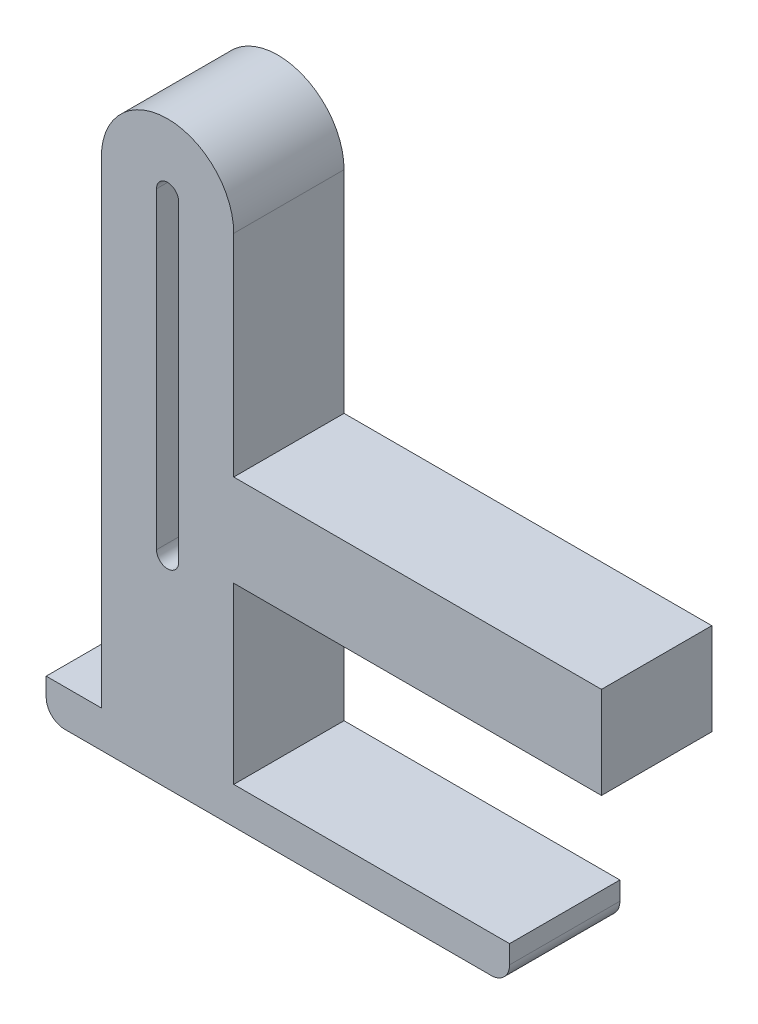
ISO-10303-21;
HEADER;
FILE_DESCRIPTION(('STEP AP214'),'2;1');
FILE_NAME('part.step','',(''),(''),'','','');
FILE_SCHEMA(('AUTOMOTIVE_DESIGN { 1 0 10303 214 1 1 1 1 }'));
ENDSEC;
DATA;
#1=APPLICATION_CONTEXT('core data for automotive mechanical design processes');
#2=APPLICATION_PROTOCOL_DEFINITION('international standard','automotive_design',2000,#1);
#3=PRODUCT_CONTEXT('',#1,'mechanical');
#4=PRODUCT('Part','Part','',(#3));
#5=PRODUCT_RELATED_PRODUCT_CATEGORY('part','',(#4));
#6=PRODUCT_DEFINITION_FORMATION('','',#4);
#7=PRODUCT_DEFINITION_CONTEXT('part definition',#1,'design');
#8=PRODUCT_DEFINITION('design','',#6,#7);
#9=PRODUCT_DEFINITION_SHAPE('','',#8);
#10=(LENGTH_UNIT() NAMED_UNIT(*) SI_UNIT(.MILLI.,.METRE.));
#11=(NAMED_UNIT(*) PLANE_ANGLE_UNIT() SI_UNIT($,.RADIAN.));
#12=(NAMED_UNIT(*) SI_UNIT($,.STERADIAN.) SOLID_ANGLE_UNIT());
#13=UNCERTAINTY_MEASURE_WITH_UNIT(LENGTH_MEASURE(1.E-05),#10,'distance_accuracy_value','');
#14=(GEOMETRIC_REPRESENTATION_CONTEXT(3) GLOBAL_UNCERTAINTY_ASSIGNED_CONTEXT((#13)) GLOBAL_UNIT_ASSIGNED_CONTEXT((#10,
#11,#12)) REPRESENTATION_CONTEXT('',''));
#15=CARTESIAN_POINT('',(0.,0.,0.));
#16=DIRECTION('',(0.,0.,1.));
#17=DIRECTION('',(1.,0.,0.));
#18=AXIS2_PLACEMENT_3D('',#15,#16,#17);
#19=CARTESIAN_POINT('',(3.6,0.,6.));
#20=DIRECTION('',(-1.,0.,0.));
#21=DIRECTION('',(0.,0.,1.));
#22=AXIS2_PLACEMENT_3D('',#19,#20,#21);
#23=PLANE('',#22);
#24=DIRECTION('',(0.,0.,1.));
#25=VECTOR('',#24,1.);
#26=CARTESIAN_POINT('',(3.6,5.522835855,6.));
#27=LINE('',#26,#25);
#28=CARTESIAN_POINT('',(3.6,5.522835855,0.));
#29=VERTEX_POINT('',#28);
#30=CARTESIAN_POINT('',(3.6,5.522835855,6.));
#31=VERTEX_POINT('',#30);
#32=EDGE_CURVE('E205',#29,#31,#27,.T.);
#33=ORIENTED_EDGE('',*,*,#32,.F.);
#34=DIRECTION('',(0.,1.,0.));
#35=VECTOR('',#34,1.);
#36=CARTESIAN_POINT('',(3.6,0.,0.));
#37=LINE('',#36,#35);
#38=CARTESIAN_POINT('',(3.6,17.,0.));
#39=VERTEX_POINT('',#38);
#40=EDGE_CURVE('E277',#29,#39,#37,.T.);
#41=ORIENTED_EDGE('',*,*,#40,.T.);
#42=DIRECTION('',(0.,0.,-1.));
#43=VECTOR('',#42,1.);
#44=CARTESIAN_POINT('',(3.6,17.,6.));
#45=LINE('',#44,#43);
#46=CARTESIAN_POINT('',(3.6,17.,6.));
#47=VERTEX_POINT('',#46);
#48=EDGE_CURVE('E285',#47,#39,#45,.T.);
#49=ORIENTED_EDGE('',*,*,#48,.F.);
#50=DIRECTION('',(0.,1.,0.));
#51=VECTOR('',#50,1.);
#52=CARTESIAN_POINT('',(3.6,0.,6.));
#53=LINE('',#52,#51);
#54=EDGE_CURVE('E269',#31,#47,#53,.T.);
#55=ORIENTED_EDGE('',*,*,#54,.F.);
#56=EDGE_LOOP('',(#33,#41,#49,#55));
#57=FACE_BOUND('',#56,.T.);
#58=ADVANCED_FACE('F36',(#57),#23,.F.);
#59=CARTESIAN_POINT('',(3.6,-8.95432829,6.));
#60=VERTEX_POINT('',#59);
#61=CARTESIAN_POINT('',(3.6,0.522835855000001,6.));
#62=VERTEX_POINT('',#61);
#63=EDGE_CURVE('E270',#60,#62,#53,.T.);
#64=ORIENTED_EDGE('',*,*,#63,.F.);
#65=DIRECTION('',(0.,0.,-1.));
#66=VECTOR('',#65,1.);
#67=CARTESIAN_POINT('',(3.6,-8.95432829,6.));
#68=LINE('',#67,#66);
#69=CARTESIAN_POINT('',(3.6,-8.95432829,0.));
#70=VERTEX_POINT('',#69);
#71=EDGE_CURVE('E201',#60,#70,#68,.T.);
#72=ORIENTED_EDGE('',*,*,#71,.T.);
#73=CARTESIAN_POINT('',(3.6,0.522835855000001,0.));
#74=VERTEX_POINT('',#73);
#75=EDGE_CURVE('E182',#70,#74,#37,.T.);
#76=ORIENTED_EDGE('',*,*,#75,.T.);
#77=DIRECTION('',(0.,0.,-1.));
#78=VECTOR('',#77,1.);
#79=CARTESIAN_POINT('',(3.6,0.522835855000002,6.));
#80=LINE('',#79,#78);
#81=EDGE_CURVE('E210',#62,#74,#80,.T.);
#82=ORIENTED_EDGE('',*,*,#81,.F.);
#83=EDGE_LOOP('',(#64,#72,#76,#82));
#84=FACE_BOUND('',#83,.T.);
#85=ADVANCED_FACE('F343',(#84),#23,.F.);
#86=CARTESIAN_POINT('',(0.,17.,6.));
#87=DIRECTION('',(0.,0.,1.));
#88=DIRECTION('',(1.,0.,0.));
#89=AXIS2_PLACEMENT_3D('',#86,#87,#88);
#90=PLANE('',#89);
#91=DIRECTION('',(1.,0.,0.));
#92=VECTOR('',#91,1.);
#93=CARTESIAN_POINT('',(3.6,-10.95432829,6.));
#94=LINE('',#93,#92);
#95=CARTESIAN_POINT('',(-5.6,-10.95432829,6.));
#96=VERTEX_POINT('',#95);
#97=CARTESIAN_POINT('',(17.6,-10.95432829,6.));
#98=VERTEX_POINT('',#97);
#99=EDGE_CURVE('E266',#96,#98,#94,.T.);
#100=ORIENTED_EDGE('',*,*,#99,.T.);
#101=CARTESIAN_POINT('',(17.6,-9.95432829,6.));
#102=DIRECTION('',(0.,0.,1.));
#103=DIRECTION('',(1.,0.,0.));
#104=AXIS2_PLACEMENT_3D('',#101,#102,#103);
#105=CIRCLE('',#104,1.);
#106=CARTESIAN_POINT('',(18.6,-9.95432829,6.));
#107=VERTEX_POINT('',#106);
#108=EDGE_CURVE('E44',#98,#107,#105,.T.);
#109=ORIENTED_EDGE('',*,*,#108,.T.);
#110=DIRECTION('',(0.,-1.,0.));
#111=VECTOR('',#110,1.);
#112=CARTESIAN_POINT('',(18.6,-8.95432829,6.));
#113=LINE('',#112,#111);
#114=CARTESIAN_POINT('',(18.6,-8.95432829,6.));
#115=VERTEX_POINT('',#114);
#116=EDGE_CURVE('E174',#115,#107,#113,.T.);
#117=ORIENTED_EDGE('',*,*,#116,.F.);
#118=DIRECTION('',(1.,0.,0.));
#119=VECTOR('',#118,1.);
#120=CARTESIAN_POINT('',(-6.6,-8.95432829,6.));
#121=LINE('',#120,#119);
#122=EDGE_CURVE('E190',#60,#115,#121,.T.);
#123=ORIENTED_EDGE('',*,*,#122,.F.);
#124=ORIENTED_EDGE('',*,*,#63,.T.);
#125=DIRECTION('',(-1.,0.,0.));
#126=VECTOR('',#125,1.);
#127=CARTESIAN_POINT('',(23.6,0.522835855000002,6.));
#128=LINE('',#127,#126);
#129=CARTESIAN_POINT('',(23.6,0.522835855000002,6.));
#130=VERTEX_POINT('',#129);
#131=EDGE_CURVE('E222',#130,#62,#128,.T.);
#132=ORIENTED_EDGE('',*,*,#131,.F.);
#133=DIRECTION('',(0.,-1.,0.));
#134=VECTOR('',#133,1.);
#135=CARTESIAN_POINT('',(23.6,0.522835855000002,6.));
#136=LINE('',#135,#134);
#137=CARTESIAN_POINT('',(23.6,5.522835855,6.));
#138=VERTEX_POINT('',#137);
#139=EDGE_CURVE('E212',#138,#130,#136,.T.);
#140=ORIENTED_EDGE('',*,*,#139,.F.);
#141=DIRECTION('',(-1.,0.,0.));
#142=VECTOR('',#141,1.);
#143=CARTESIAN_POINT('',(23.6,5.522835855,6.));
#144=LINE('',#143,#142);
#145=EDGE_CURVE('E225',#138,#31,#144,.T.);
#146=ORIENTED_EDGE('',*,*,#145,.T.);
#147=ORIENTED_EDGE('',*,*,#54,.T.);
#148=CARTESIAN_POINT('',(0.,17.,6.));
#149=DIRECTION('',(0.,0.,1.));
#150=DIRECTION('',(1.,0.,0.));
#151=AXIS2_PLACEMENT_3D('',#148,#149,#150);
#152=CIRCLE('',#151,3.6);
#153=CARTESIAN_POINT('',(-3.6,17.,6.));
#154=VERTEX_POINT('',#153);
#155=EDGE_CURVE('E272',#47,#154,#152,.T.);
#156=ORIENTED_EDGE('',*,*,#155,.T.);
#157=DIRECTION('',(0.,-1.,0.));
#158=VECTOR('',#157,1.);
#159=CARTESIAN_POINT('',(-3.6,-10.95432829,6.));
#160=LINE('',#159,#158);
#161=CARTESIAN_POINT('',(-3.6,-8.95432829,6.));
#162=VERTEX_POINT('',#161);
#163=EDGE_CURVE('E263',#154,#162,#160,.T.);
#164=ORIENTED_EDGE('',*,*,#163,.T.);
#165=CARTESIAN_POINT('',(-6.6,-8.95432829,6.));
#166=VERTEX_POINT('',#165);
#167=EDGE_CURVE('E200',#166,#162,#121,.T.);
#168=ORIENTED_EDGE('',*,*,#167,.F.);
#169=DIRECTION('',(0.,-1.,0.));
#170=VECTOR('',#169,1.);
#171=CARTESIAN_POINT('',(-6.6,-8.95432829,6.));
#172=LINE('',#171,#170);
#173=CARTESIAN_POINT('',(-6.6,-9.95432829,6.));
#174=VERTEX_POINT('',#173);
#175=EDGE_CURVE('E191',#166,#174,#172,.T.);
#176=ORIENTED_EDGE('',*,*,#175,.T.);
#177=CARTESIAN_POINT('',(-5.6,-9.95432829,6.));
#178=DIRECTION('',(0.,0.,1.));
#179=DIRECTION('',(1.,0.,0.));
#180=AXIS2_PLACEMENT_3D('',#177,#178,#179);
#181=CIRCLE('',#180,1.);
#182=EDGE_CURVE('E300',#174,#96,#181,.T.);
#183=ORIENTED_EDGE('',*,*,#182,.T.);
#184=EDGE_LOOP('',(#100,#109,#117,#123,#124,#132,#140,#146,#147,#156,#164,#168,#176,#183));
#185=FACE_BOUND('',#184,.T.);
#186=DIRECTION('',(0.,1.,0.));
#187=VECTOR('',#186,1.);
#188=CARTESIAN_POINT('',(0.600000000000001,0.,6.));
#189=LINE('',#188,#187);
#190=CARTESIAN_POINT('',(0.600000000000001,0.,6.));
#191=VERTEX_POINT('',#190);
#192=CARTESIAN_POINT('',(0.600000000000001,17.,6.));
#193=VERTEX_POINT('',#192);
#194=EDGE_CURVE('E234',#191,#193,#189,.T.);
#195=ORIENTED_EDGE('',*,*,#194,.F.);
#196=CARTESIAN_POINT('',(0.,0.,6.));
#197=DIRECTION('',(0.,0.,1.));
#198=DIRECTION('',(1.,0.,0.));
#199=AXIS2_PLACEMENT_3D('',#196,#197,#198);
#200=CIRCLE('',#199,0.600000000000001);
#201=CARTESIAN_POINT('',(-0.600000000000001,0.,6.));
#202=VERTEX_POINT('',#201);
#203=EDGE_CURVE('E232',#202,#191,#200,.T.);
#204=ORIENTED_EDGE('',*,*,#203,.F.);
#205=DIRECTION('',(0.,-1.,0.));
#206=VECTOR('',#205,1.);
#207=CARTESIAN_POINT('',(-0.600000000000001,0.,6.));
#208=LINE('',#207,#206);
#209=CARTESIAN_POINT('',(-0.600000000000001,17.,6.));
#210=VERTEX_POINT('',#209);
#211=EDGE_CURVE('E240',#210,#202,#208,.T.);
#212=ORIENTED_EDGE('',*,*,#211,.F.);
#213=CARTESIAN_POINT('',(0.,17.,6.));
#214=DIRECTION('',(0.,0.,1.));
#215=DIRECTION('',(1.,0.,0.));
#216=AXIS2_PLACEMENT_3D('',#213,#214,#215);
#217=CIRCLE('',#216,0.600000000000001);
#218=EDGE_CURVE('E237',#193,#210,#217,.T.);
#219=ORIENTED_EDGE('',*,*,#218,.F.);
#220=EDGE_LOOP('',(#195,#204,#212,#219));
#221=FACE_BOUND('',#220,.T.);
#222=ADVANCED_FACE('F303',(#185,#221),#90,.T.);
#223=CARTESIAN_POINT('',(0.,17.,0.));
#224=DIRECTION('',(0.,0.,1.));
#225=DIRECTION('',(1.,0.,0.));
#226=AXIS2_PLACEMENT_3D('',#223,#224,#225);
#227=PLANE('',#226);
#228=DIRECTION('',(0.,1.,0.));
#229=VECTOR('',#228,1.);
#230=CARTESIAN_POINT('',(18.6,-8.95432829,0.));
#231=LINE('',#230,#229);
#232=CARTESIAN_POINT('',(18.6,-9.95432829,0.));
#233=VERTEX_POINT('',#232);
#234=CARTESIAN_POINT('',(18.6,-8.95432829,0.));
#235=VERTEX_POINT('',#234);
#236=EDGE_CURVE('E164',#233,#235,#231,.T.);
#237=ORIENTED_EDGE('',*,*,#236,.F.);
#238=CARTESIAN_POINT('',(17.6,-9.95432829,0.));
#239=DIRECTION('',(0.,0.,1.));
#240=DIRECTION('',(1.,0.,0.));
#241=AXIS2_PLACEMENT_3D('',#238,#239,#240);
#242=CIRCLE('',#241,1.);
#243=CARTESIAN_POINT('',(17.6,-10.95432829,0.));
#244=VERTEX_POINT('',#243);
#245=EDGE_CURVE('E294',#233,#244,#242,.F.);
#246=ORIENTED_EDGE('',*,*,#245,.T.);
#247=DIRECTION('',(1.,0.,0.));
#248=VECTOR('',#247,1.);
#249=CARTESIAN_POINT('',(3.6,-10.95432829,0.));
#250=LINE('',#249,#248);
#251=CARTESIAN_POINT('',(-5.6,-10.95432829,0.));
#252=VERTEX_POINT('',#251);
#253=EDGE_CURVE('E262',#252,#244,#250,.T.);
#254=ORIENTED_EDGE('',*,*,#253,.F.);
#255=CARTESIAN_POINT('',(-5.6,-9.95432829,0.));
#256=DIRECTION('',(0.,0.,1.));
#257=DIRECTION('',(1.,0.,0.));
#258=AXIS2_PLACEMENT_3D('',#255,#256,#257);
#259=CIRCLE('',#258,1.);
#260=CARTESIAN_POINT('',(-6.6,-9.95432829,0.));
#261=VERTEX_POINT('',#260);
#262=EDGE_CURVE('E292',#252,#261,#259,.F.);
#263=ORIENTED_EDGE('',*,*,#262,.T.);
#264=DIRECTION('',(0.,1.,0.));
#265=VECTOR('',#264,1.);
#266=CARTESIAN_POINT('',(-6.6,-8.95432829,0.));
#267=LINE('',#266,#265);
#268=CARTESIAN_POINT('',(-6.6,-8.95432829,0.));
#269=VERTEX_POINT('',#268);
#270=EDGE_CURVE('E193',#261,#269,#267,.T.);
#271=ORIENTED_EDGE('',*,*,#270,.T.);
#272=DIRECTION('',(1.,0.,0.));
#273=VECTOR('',#272,1.);
#274=CARTESIAN_POINT('',(-6.6,-8.95432829,0.));
#275=LINE('',#274,#273);
#276=CARTESIAN_POINT('',(-3.6,-8.95432829,0.));
#277=VERTEX_POINT('',#276);
#278=EDGE_CURVE('E185',#269,#277,#275,.T.);
#279=ORIENTED_EDGE('',*,*,#278,.T.);
#280=DIRECTION('',(0.,-1.,0.));
#281=VECTOR('',#280,1.);
#282=CARTESIAN_POINT('',(-3.6,0.,0.));
#283=LINE('',#282,#281);
#284=CARTESIAN_POINT('',(-3.6,17.,0.));
#285=VERTEX_POINT('',#284);
#286=EDGE_CURVE('E267',#285,#277,#283,.T.);
#287=ORIENTED_EDGE('',*,*,#286,.F.);
#288=CARTESIAN_POINT('',(0.,17.,0.));
#289=DIRECTION('',(0.,0.,1.));
#290=DIRECTION('',(1.,0.,0.));
#291=AXIS2_PLACEMENT_3D('',#288,#289,#290);
#292=CIRCLE('',#291,3.6);
#293=EDGE_CURVE('E279',#39,#285,#292,.T.);
#294=ORIENTED_EDGE('',*,*,#293,.F.);
#295=ORIENTED_EDGE('',*,*,#40,.F.);
#296=DIRECTION('',(-1.,0.,0.));
#297=VECTOR('',#296,1.);
#298=CARTESIAN_POINT('',(23.6,5.522835855,0.));
#299=LINE('',#298,#297);
#300=CARTESIAN_POINT('',(23.6,5.522835855,0.));
#301=VERTEX_POINT('',#300);
#302=EDGE_CURVE('E228',#301,#29,#299,.T.);
#303=ORIENTED_EDGE('',*,*,#302,.F.);
#304=DIRECTION('',(0.,1.,0.));
#305=VECTOR('',#304,1.);
#306=CARTESIAN_POINT('',(23.6,0.522835855000001,0.));
#307=LINE('',#306,#305);
#308=CARTESIAN_POINT('',(23.6,0.522835855000001,0.));
#309=VERTEX_POINT('',#308);
#310=EDGE_CURVE('E206',#309,#301,#307,.T.);
#311=ORIENTED_EDGE('',*,*,#310,.F.);
#312=DIRECTION('',(-1.,0.,0.));
#313=VECTOR('',#312,1.);
#314=CARTESIAN_POINT('',(23.6,0.522835855000001,0.));
#315=LINE('',#314,#313);
#316=EDGE_CURVE('E216',#309,#74,#315,.T.);
#317=ORIENTED_EDGE('',*,*,#316,.T.);
#318=ORIENTED_EDGE('',*,*,#75,.F.);
#319=EDGE_CURVE('E178',#70,#235,#275,.T.);
#320=ORIENTED_EDGE('',*,*,#319,.T.);
#321=EDGE_LOOP('',(#237,#246,#254,#263,#271,#279,#287,#294,#295,#303,#311,#317,#318,#320));
#322=FACE_BOUND('',#321,.T.);
#323=CARTESIAN_POINT('',(0.,0.,0.));
#324=DIRECTION('',(0.,0.,1.));
#325=DIRECTION('',(1.,0.,0.));
#326=AXIS2_PLACEMENT_3D('',#323,#324,#325);
#327=CIRCLE('',#326,0.600000000000001);
#328=CARTESIAN_POINT('',(-0.600000000000001,0.,0.));
#329=VERTEX_POINT('',#328);
#330=CARTESIAN_POINT('',(0.600000000000001,0.,0.));
#331=VERTEX_POINT('',#330);
#332=EDGE_CURVE('E231',#329,#331,#327,.T.);
#333=ORIENTED_EDGE('',*,*,#332,.T.);
#334=DIRECTION('',(0.,1.,0.));
#335=VECTOR('',#334,1.);
#336=CARTESIAN_POINT('',(0.600000000000001,0.,0.));
#337=LINE('',#336,#335);
#338=CARTESIAN_POINT('',(0.600000000000001,17.,0.));
#339=VERTEX_POINT('',#338);
#340=EDGE_CURVE('E245',#331,#339,#337,.T.);
#341=ORIENTED_EDGE('',*,*,#340,.T.);
#342=CARTESIAN_POINT('',(0.,17.,0.));
#343=DIRECTION('',(0.,0.,1.));
#344=DIRECTION('',(1.,0.,0.));
#345=AXIS2_PLACEMENT_3D('',#342,#343,#344);
#346=CIRCLE('',#345,0.600000000000001);
#347=CARTESIAN_POINT('',(-0.600000000000001,17.,0.));
#348=VERTEX_POINT('',#347);
#349=EDGE_CURVE('E248',#339,#348,#346,.T.);
#350=ORIENTED_EDGE('',*,*,#349,.T.);
#351=DIRECTION('',(0.,-1.,0.));
#352=VECTOR('',#351,1.);
#353=CARTESIAN_POINT('',(-0.600000000000001,0.,0.));
#354=LINE('',#353,#352);
#355=EDGE_CURVE('E235',#348,#329,#354,.T.);
#356=ORIENTED_EDGE('',*,*,#355,.T.);
#357=EDGE_LOOP('',(#333,#341,#350,#356));
#358=FACE_BOUND('',#357,.T.);
#359=ADVANCED_FACE('F179',(#322,#358),#227,.F.);
#360=CARTESIAN_POINT('',(3.6,-10.95432829,6.));
#361=DIRECTION('',(0.,1.,0.));
#362=DIRECTION('',(0.,0.,1.));
#363=AXIS2_PLACEMENT_3D('',#360,#361,#362);
#364=PLANE('',#363);
#365=ORIENTED_EDGE('',*,*,#253,.T.);
#366=DIRECTION('',(0.,0.,-1.));
#367=VECTOR('',#366,1.);
#368=CARTESIAN_POINT('',(17.6,-10.95432829,6.));
#369=LINE('',#368,#367);
#370=EDGE_CURVE('E57',#244,#98,#369,.F.);
#371=ORIENTED_EDGE('',*,*,#370,.T.);
#372=ORIENTED_EDGE('',*,*,#99,.F.);
#373=DIRECTION('',(0.,0.,-1.));
#374=VECTOR('',#373,1.);
#375=CARTESIAN_POINT('',(-5.6,-10.95432829,6.));
#376=LINE('',#375,#374);
#377=EDGE_CURVE('E296',#96,#252,#376,.T.);
#378=ORIENTED_EDGE('',*,*,#377,.T.);
#379=EDGE_LOOP('',(#365,#371,#372,#378));
#380=FACE_BOUND('',#379,.T.);
#381=ADVANCED_FACE('F308',(#380),#364,.F.);
#382=CARTESIAN_POINT('',(0.,17.,6.));
#383=DIRECTION('',(0.,0.,-1.));
#384=DIRECTION('',(-1.,0.,0.));
#385=AXIS2_PLACEMENT_3D('',#382,#383,#384);
#386=CYLINDRICAL_SURFACE('',#385,3.6);
#387=ORIENTED_EDGE('',*,*,#293,.T.);
#388=DIRECTION('',(0.,0.,-1.));
#389=VECTOR('',#388,1.);
#390=CARTESIAN_POINT('',(-3.6,17.,6.));
#391=LINE('',#390,#389);
#392=EDGE_CURVE('E275',#154,#285,#391,.T.);
#393=ORIENTED_EDGE('',*,*,#392,.F.);
#394=ORIENTED_EDGE('',*,*,#155,.F.);
#395=ORIENTED_EDGE('',*,*,#48,.T.);
#396=EDGE_LOOP('',(#387,#393,#394,#395));
#397=FACE_BOUND('',#396,.T.);
#398=ADVANCED_FACE('F324',(#397),#386,.T.);
#399=CARTESIAN_POINT('',(-3.6,0.,6.));
#400=DIRECTION('',(1.,0.,0.));
#401=DIRECTION('',(0.,0.,-1.));
#402=AXIS2_PLACEMENT_3D('',#399,#400,#401);
#403=PLANE('',#402);
#404=ORIENTED_EDGE('',*,*,#286,.T.);
#405=DIRECTION('',(0.,0.,1.));
#406=VECTOR('',#405,1.);
#407=CARTESIAN_POINT('',(-3.6,-8.95432829,6.));
#408=LINE('',#407,#406);
#409=EDGE_CURVE('E288',#277,#162,#408,.T.);
#410=ORIENTED_EDGE('',*,*,#409,.T.);
#411=ORIENTED_EDGE('',*,*,#163,.F.);
#412=ORIENTED_EDGE('',*,*,#392,.T.);
#413=EDGE_LOOP('',(#404,#410,#411,#412));
#414=FACE_BOUND('',#413,.T.);
#415=ADVANCED_FACE('F320',(#414),#403,.F.);
#416=CARTESIAN_POINT('',(0.,0.,6.));
#417=DIRECTION('',(0.,0.,-1.));
#418=DIRECTION('',(-1.,0.,0.));
#419=AXIS2_PLACEMENT_3D('',#416,#417,#418);
#420=CYLINDRICAL_SURFACE('',#419,0.600000000000001);
#421=ORIENTED_EDGE('',*,*,#332,.F.);
#422=DIRECTION('',(0.,0.,-1.));
#423=VECTOR('',#422,1.);
#424=CARTESIAN_POINT('',(-0.600000000000001,0.,6.));
#425=LINE('',#424,#423);
#426=EDGE_CURVE('E242',#202,#329,#425,.T.);
#427=ORIENTED_EDGE('',*,*,#426,.F.);
#428=ORIENTED_EDGE('',*,*,#203,.T.);
#429=DIRECTION('',(0.,0.,-1.));
#430=VECTOR('',#429,1.);
#431=CARTESIAN_POINT('',(0.600000000000001,0.,6.));
#432=LINE('',#431,#430);
#433=EDGE_CURVE('E259',#191,#331,#432,.T.);
#434=ORIENTED_EDGE('',*,*,#433,.T.);
#435=EDGE_LOOP('',(#421,#427,#428,#434));
#436=FACE_BOUND('',#435,.T.);
#437=ADVANCED_FACE('F383',(#436),#420,.F.);
#438=CARTESIAN_POINT('',(0.600000000000001,0.,6.));
#439=DIRECTION('',(-1.,0.,0.));
#440=DIRECTION('',(0.,0.,1.));
#441=AXIS2_PLACEMENT_3D('',#438,#439,#440);
#442=PLANE('',#441);
#443=ORIENTED_EDGE('',*,*,#340,.F.);
#444=ORIENTED_EDGE('',*,*,#433,.F.);
#445=ORIENTED_EDGE('',*,*,#194,.T.);
#446=DIRECTION('',(0.,0.,-1.));
#447=VECTOR('',#446,1.);
#448=CARTESIAN_POINT('',(0.600000000000001,17.,6.));
#449=LINE('',#448,#447);
#450=EDGE_CURVE('E257',#193,#339,#449,.T.);
#451=ORIENTED_EDGE('',*,*,#450,.T.);
#452=EDGE_LOOP('',(#443,#444,#445,#451));
#453=FACE_BOUND('',#452,.T.);
#454=ADVANCED_FACE('F379',(#453),#442,.T.);
#455=CARTESIAN_POINT('',(0.,17.,6.));
#456=DIRECTION('',(0.,0.,-1.));
#457=DIRECTION('',(-1.,0.,0.));
#458=AXIS2_PLACEMENT_3D('',#455,#456,#457);
#459=CYLINDRICAL_SURFACE('',#458,0.600000000000001);
#460=ORIENTED_EDGE('',*,*,#349,.F.);
#461=ORIENTED_EDGE('',*,*,#450,.F.);
#462=ORIENTED_EDGE('',*,*,#218,.T.);
#463=DIRECTION('',(0.,0.,-1.));
#464=VECTOR('',#463,1.);
#465=CARTESIAN_POINT('',(-0.600000000000001,17.,6.));
#466=LINE('',#465,#464);
#467=EDGE_CURVE('E255',#210,#348,#466,.T.);
#468=ORIENTED_EDGE('',*,*,#467,.T.);
#469=EDGE_LOOP('',(#460,#461,#462,#468));
#470=FACE_BOUND('',#469,.T.);
#471=ADVANCED_FACE('F375',(#470),#459,.F.);
#472=CARTESIAN_POINT('',(-0.600000000000001,0.,6.));
#473=DIRECTION('',(1.,0.,0.));
#474=DIRECTION('',(0.,0.,-1.));
#475=AXIS2_PLACEMENT_3D('',#472,#473,#474);
#476=PLANE('',#475);
#477=ORIENTED_EDGE('',*,*,#355,.F.);
#478=ORIENTED_EDGE('',*,*,#467,.F.);
#479=ORIENTED_EDGE('',*,*,#211,.T.);
#480=ORIENTED_EDGE('',*,*,#426,.T.);
#481=EDGE_LOOP('',(#477,#478,#479,#480));
#482=FACE_BOUND('',#481,.T.);
#483=ADVANCED_FACE('F372',(#482),#476,.T.);
#484=CARTESIAN_POINT('',(23.6,5.522835855,6.));
#485=DIRECTION('',(0.,-1.,0.));
#486=DIRECTION('',(0.,0.,-1.));
#487=AXIS2_PLACEMENT_3D('',#484,#485,#486);
#488=PLANE('',#487);
#489=ORIENTED_EDGE('',*,*,#32,.T.);
#490=ORIENTED_EDGE('',*,*,#145,.F.);
#491=DIRECTION('',(0.,0.,1.));
#492=VECTOR('',#491,1.);
#493=CARTESIAN_POINT('',(23.6,5.522835855,6.));
#494=LINE('',#493,#492);
#495=EDGE_CURVE('E209',#301,#138,#494,.T.);
#496=ORIENTED_EDGE('',*,*,#495,.F.);
#497=ORIENTED_EDGE('',*,*,#302,.T.);
#498=EDGE_LOOP('',(#489,#490,#496,#497));
#499=FACE_BOUND('',#498,.T.);
#500=ADVANCED_FACE('F331',(#499),#488,.F.);
#501=CARTESIAN_POINT('',(23.6,0.522835855000002,6.));
#502=DIRECTION('',(0.,1.,0.));
#503=DIRECTION('',(0.,0.,1.));
#504=AXIS2_PLACEMENT_3D('',#501,#502,#503);
#505=PLANE('',#504);
#506=ORIENTED_EDGE('',*,*,#81,.T.);
#507=ORIENTED_EDGE('',*,*,#316,.F.);
#508=DIRECTION('',(0.,0.,-1.));
#509=VECTOR('',#508,1.);
#510=CARTESIAN_POINT('',(23.6,0.522835855000002,6.));
#511=LINE('',#510,#509);
#512=EDGE_CURVE('E214',#130,#309,#511,.T.);
#513=ORIENTED_EDGE('',*,*,#512,.F.);
#514=ORIENTED_EDGE('',*,*,#131,.T.);
#515=EDGE_LOOP('',(#506,#507,#513,#514));
#516=FACE_BOUND('',#515,.T.);
#517=ADVANCED_FACE('F339',(#516),#505,.F.);
#518=CARTESIAN_POINT('',(23.6,0.,0.));
#519=DIRECTION('',(-1.,0.,0.));
#520=DIRECTION('',(0.,0.,1.));
#521=AXIS2_PLACEMENT_3D('',#518,#519,#520);
#522=PLANE('',#521);
#523=ORIENTED_EDGE('',*,*,#310,.T.);
#524=ORIENTED_EDGE('',*,*,#495,.T.);
#525=ORIENTED_EDGE('',*,*,#139,.T.);
#526=ORIENTED_EDGE('',*,*,#512,.T.);
#527=EDGE_LOOP('',(#523,#524,#525,#526));
#528=FACE_BOUND('',#527,.T.);
#529=ADVANCED_FACE('F335',(#528),#522,.F.);
#530=CARTESIAN_POINT('',(-6.6,0.,0.));
#531=DIRECTION('',(1.,0.,0.));
#532=DIRECTION('',(0.,0.,-1.));
#533=AXIS2_PLACEMENT_3D('',#530,#531,#532);
#534=PLANE('',#533);
#535=ORIENTED_EDGE('',*,*,#270,.F.);
#536=DIRECTION('',(0.,0.,-1.));
#537=VECTOR('',#536,1.);
#538=CARTESIAN_POINT('',(-6.6,-9.95432829,0.));
#539=LINE('',#538,#537);
#540=EDGE_CURVE('E11',#261,#174,#539,.F.);
#541=ORIENTED_EDGE('',*,*,#540,.T.);
#542=ORIENTED_EDGE('',*,*,#175,.F.);
#543=DIRECTION('',(0.,0.,1.));
#544=VECTOR('',#543,1.);
#545=CARTESIAN_POINT('',(-6.6,-8.95432829,6.));
#546=LINE('',#545,#544);
#547=EDGE_CURVE('E186',#269,#166,#546,.T.);
#548=ORIENTED_EDGE('',*,*,#547,.F.);
#549=EDGE_LOOP('',(#535,#541,#542,#548));
#550=FACE_BOUND('',#549,.T.);
#551=ADVANCED_FACE('F314',(#550),#534,.F.);
#552=CARTESIAN_POINT('',(-6.6,-8.95432829,6.));
#553=DIRECTION('',(0.,1.,0.));
#554=DIRECTION('',(0.,0.,1.));
#555=AXIS2_PLACEMENT_3D('',#552,#553,#554);
#556=PLANE('',#555);
#557=ORIENTED_EDGE('',*,*,#409,.F.);
#558=ORIENTED_EDGE('',*,*,#278,.F.);
#559=ORIENTED_EDGE('',*,*,#547,.T.);
#560=ORIENTED_EDGE('',*,*,#167,.T.);
#561=EDGE_LOOP('',(#557,#558,#559,#560));
#562=FACE_BOUND('',#561,.T.);
#563=ADVANCED_FACE('F316',(#562),#556,.T.);
#564=ORIENTED_EDGE('',*,*,#71,.F.);
#565=ORIENTED_EDGE('',*,*,#122,.T.);
#566=DIRECTION('',(0.,0.,1.));
#567=VECTOR('',#566,1.);
#568=CARTESIAN_POINT('',(18.6,-8.95432829,6.));
#569=LINE('',#568,#567);
#570=EDGE_CURVE('E169',#235,#115,#569,.T.);
#571=ORIENTED_EDGE('',*,*,#570,.F.);
#572=ORIENTED_EDGE('',*,*,#319,.F.);
#573=EDGE_LOOP('',(#564,#565,#571,#572));
#574=FACE_BOUND('',#573,.T.);
#575=ADVANCED_FACE('F188',(#574),#556,.T.);
#576=CARTESIAN_POINT('',(18.6,0.,0.));
#577=DIRECTION('',(1.,0.,0.));
#578=DIRECTION('',(0.,0.,-1.));
#579=AXIS2_PLACEMENT_3D('',#576,#577,#578);
#580=PLANE('',#579);
#581=ORIENTED_EDGE('',*,*,#116,.T.);
#582=DIRECTION('',(0.,0.,-1.));
#583=VECTOR('',#582,1.);
#584=CARTESIAN_POINT('',(18.6,-9.95432829,0.));
#585=LINE('',#584,#583);
#586=EDGE_CURVE('E172',#107,#233,#585,.T.);
#587=ORIENTED_EDGE('',*,*,#586,.T.);
#588=ORIENTED_EDGE('',*,*,#236,.T.);
#589=ORIENTED_EDGE('',*,*,#570,.T.);
#590=EDGE_LOOP('',(#581,#587,#588,#589));
#591=FACE_BOUND('',#590,.T.);
#592=ADVANCED_FACE('F167',(#591),#580,.T.);
#593=CARTESIAN_POINT('',(17.6,-9.95432829,0.));
#594=DIRECTION('',(0.,0.,1.));
#595=DIRECTION('',(1.,0.,0.));
#596=AXIS2_PLACEMENT_3D('',#593,#594,#595);
#597=CYLINDRICAL_SURFACE('',#596,1.);
#598=ORIENTED_EDGE('',*,*,#108,.F.);
#599=ORIENTED_EDGE('',*,*,#370,.F.);
#600=ORIENTED_EDGE('',*,*,#245,.F.);
#601=ORIENTED_EDGE('',*,*,#586,.F.);
#602=EDGE_LOOP('',(#598,#599,#600,#601));
#603=FACE_BOUND('',#602,.T.);
#604=ADVANCED_FACE('F306',(#603),#597,.T.);
#605=CARTESIAN_POINT('',(-5.6,-9.95432829,6.));
#606=DIRECTION('',(0.,0.,-1.));
#607=DIRECTION('',(-1.,0.,0.));
#608=AXIS2_PLACEMENT_3D('',#605,#606,#607);
#609=CYLINDRICAL_SURFACE('',#608,1.);
#610=ORIENTED_EDGE('',*,*,#182,.F.);
#611=ORIENTED_EDGE('',*,*,#540,.F.);
#612=ORIENTED_EDGE('',*,*,#262,.F.);
#613=ORIENTED_EDGE('',*,*,#377,.F.);
#614=EDGE_LOOP('',(#610,#611,#612,#613));
#615=FACE_BOUND('',#614,.T.);
#616=ADVANCED_FACE('F38',(#615),#609,.T.);
#617=CLOSED_SHELL('',(#58,#85,#222,#359,#381,#398,#415,#437,#454,#471,#483,#500,#517,#529,#551,
#563,#575,#592,#604,#616));
#618=MANIFOLD_SOLID_BREP('B2',#617);
#619=ADVANCED_BREP_SHAPE_REPRESENTATION('',(#18,#618),#14);
#620=SHAPE_DEFINITION_REPRESENTATION(#9,#619);
ENDSEC;
END-ISO-10303-21;
